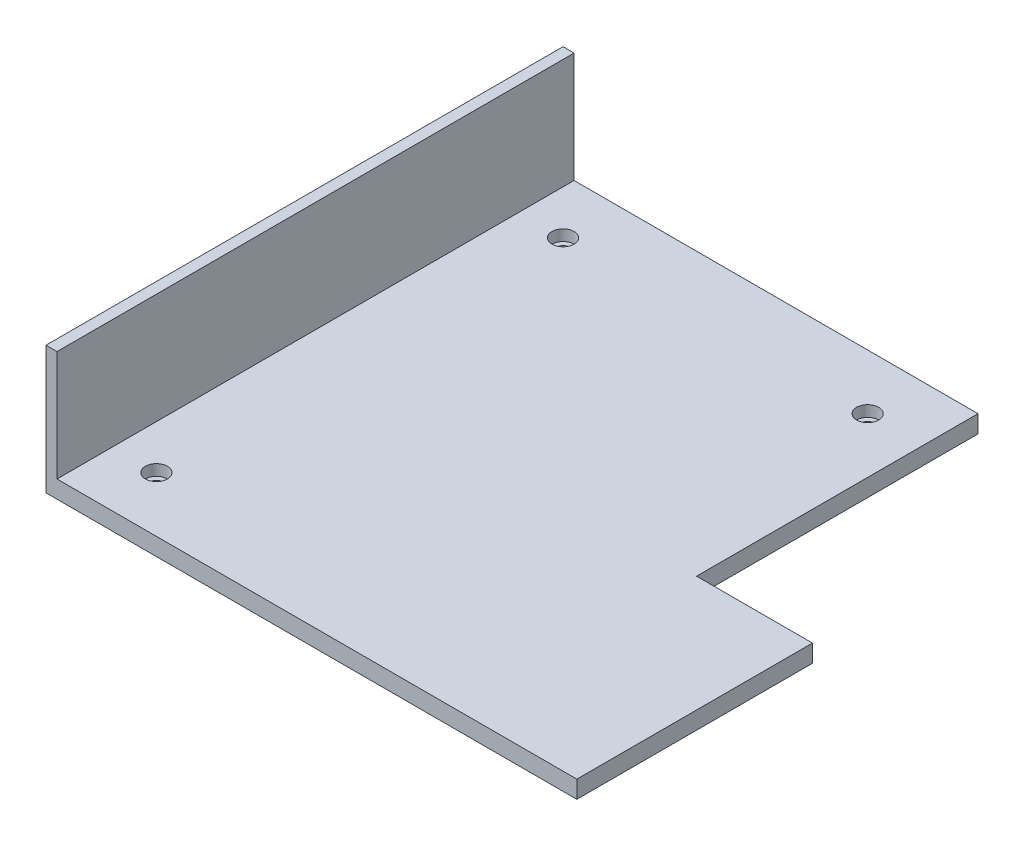
ISO-10303-21;
HEADER;
FILE_DESCRIPTION(('STEP AP214'),'2;1');
FILE_NAME('part.step','',(''),(''),'','','');
FILE_SCHEMA(('AUTOMOTIVE_DESIGN { 1 0 10303 214 1 1 1 1 }'));
ENDSEC;
DATA;
#1=APPLICATION_CONTEXT('core data for automotive mechanical design processes');
#2=APPLICATION_PROTOCOL_DEFINITION('international standard','automotive_design',2000,#1);
#3=PRODUCT_CONTEXT('',#1,'mechanical');
#4=PRODUCT('Part','Part','',(#3));
#5=PRODUCT_RELATED_PRODUCT_CATEGORY('part','',(#4));
#6=PRODUCT_DEFINITION_FORMATION('','',#4);
#7=PRODUCT_DEFINITION_CONTEXT('part definition',#1,'design');
#8=PRODUCT_DEFINITION('design','',#6,#7);
#9=PRODUCT_DEFINITION_SHAPE('','',#8);
#10=(LENGTH_UNIT() NAMED_UNIT(*) SI_UNIT(.MILLI.,.METRE.));
#11=(NAMED_UNIT(*) PLANE_ANGLE_UNIT() SI_UNIT($,.RADIAN.));
#12=(NAMED_UNIT(*) SI_UNIT($,.STERADIAN.) SOLID_ANGLE_UNIT());
#13=UNCERTAINTY_MEASURE_WITH_UNIT(LENGTH_MEASURE(1.E-05),#10,'distance_accuracy_value','');
#14=(GEOMETRIC_REPRESENTATION_CONTEXT(3) GLOBAL_UNCERTAINTY_ASSIGNED_CONTEXT((#13)) GLOBAL_UNIT_ASSIGNED_CONTEXT((#10,
#11,#12)) REPRESENTATION_CONTEXT('',''));
#15=CARTESIAN_POINT('',(0.,0.,0.));
#16=DIRECTION('',(0.,0.,1.));
#17=DIRECTION('',(1.,0.,0.));
#18=AXIS2_PLACEMENT_3D('',#15,#16,#17);
#19=CARTESIAN_POINT('',(96.2,6.35,-93.7));
#20=DIRECTION('',(-1.,0.,0.));
#21=DIRECTION('',(0.,0.,1.));
#22=AXIS2_PLACEMENT_3D('',#19,#20,#21);
#23=PLANE('',#22);
#24=DIRECTION('',(0.,0.,-1.));
#25=VECTOR('',#24,1.);
#26=CARTESIAN_POINT('',(96.2,0.,-93.7));
#27=LINE('',#26,#25);
#28=CARTESIAN_POINT('',(96.2,0.,93.7));
#29=VERTEX_POINT('',#28);
#30=CARTESIAN_POINT('',(96.2,0.,8.3));
#31=VERTEX_POINT('',#30);
#32=EDGE_CURVE('E146',#29,#31,#27,.T.);
#33=ORIENTED_EDGE('',*,*,#32,.T.);
#34=DIRECTION('',(0.,1.,0.));
#35=VECTOR('',#34,1.);
#36=CARTESIAN_POINT('',(96.2,-0.00100000000000013,8.3));
#37=LINE('',#36,#35);
#38=CARTESIAN_POINT('',(96.2,6.35,8.3));
#39=VERTEX_POINT('',#38);
#40=EDGE_CURVE('E180',#31,#39,#37,.T.);
#41=ORIENTED_EDGE('',*,*,#40,.T.);
#42=DIRECTION('',(0.,0.,-1.));
#43=VECTOR('',#42,1.);
#44=CARTESIAN_POINT('',(96.2,6.35,-93.7));
#45=LINE('',#44,#43);
#46=CARTESIAN_POINT('',(96.2,6.35,93.7));
#47=VERTEX_POINT('',#46);
#48=EDGE_CURVE('E136',#47,#39,#45,.T.);
#49=ORIENTED_EDGE('',*,*,#48,.F.);
#50=DIRECTION('',(0.,-1.,0.));
#51=VECTOR('',#50,1.);
#52=CARTESIAN_POINT('',(96.2,6.35,93.7));
#53=LINE('',#52,#51);
#54=EDGE_CURVE('E140',#47,#29,#53,.T.);
#55=ORIENTED_EDGE('',*,*,#54,.T.);
#56=EDGE_LOOP('',(#33,#41,#49,#55));
#57=FACE_BOUND('',#56,.T.);
#58=ADVANCED_FACE('F45',(#57),#23,.F.);
#59=CARTESIAN_POINT('',(-96.2,6.35,-93.7));
#60=DIRECTION('',(0.,0.,1.));
#61=DIRECTION('',(1.,0.,0.));
#62=AXIS2_PLACEMENT_3D('',#59,#60,#61);
#63=PLANE('',#62);
#64=DIRECTION('',(-1.,0.,0.));
#65=VECTOR('',#64,1.);
#66=CARTESIAN_POINT('',(-96.2,6.35,-93.7));
#67=LINE('',#66,#65);
#68=CARTESIAN_POINT('',(54.2,6.35,-93.7));
#69=VERTEX_POINT('',#68);
#70=CARTESIAN_POINT('',(-92.2,6.35,-93.7));
#71=VERTEX_POINT('',#70);
#72=EDGE_CURVE('E125',#69,#71,#67,.T.);
#73=ORIENTED_EDGE('',*,*,#72,.F.);
#74=DIRECTION('',(0.,1.,0.));
#75=VECTOR('',#74,1.);
#76=CARTESIAN_POINT('',(54.2,-0.00100000000000013,-93.7));
#77=LINE('',#76,#75);
#78=CARTESIAN_POINT('',(54.2,0.,-93.7));
#79=VERTEX_POINT('',#78);
#80=EDGE_CURVE('E110',#79,#69,#77,.T.);
#81=ORIENTED_EDGE('',*,*,#80,.F.);
#82=DIRECTION('',(-1.,0.,0.));
#83=VECTOR('',#82,1.);
#84=CARTESIAN_POINT('',(-96.2,0.,-93.7));
#85=LINE('',#84,#83);
#86=CARTESIAN_POINT('',(-96.2,0.,-93.7));
#87=VERTEX_POINT('',#86);
#88=EDGE_CURVE('E150',#79,#87,#85,.T.);
#89=ORIENTED_EDGE('',*,*,#88,.T.);
#90=DIRECTION('',(0.,-1.,0.));
#91=VECTOR('',#90,1.);
#92=CARTESIAN_POINT('',(-96.2,6.35,-93.7));
#93=LINE('',#92,#91);
#94=CARTESIAN_POINT('',(-96.2,46.35,-93.7));
#95=VERTEX_POINT('',#94);
#96=EDGE_CURVE('E11',#95,#87,#93,.T.);
#97=ORIENTED_EDGE('',*,*,#96,.F.);
#98=DIRECTION('',(-1.,0.,0.));
#99=VECTOR('',#98,1.);
#100=CARTESIAN_POINT('',(-92.2,46.35,-93.7));
#101=LINE('',#100,#99);
#102=CARTESIAN_POINT('',(-92.2,46.35,-93.7));
#103=VERTEX_POINT('',#102);
#104=EDGE_CURVE('E192',#103,#95,#101,.T.);
#105=ORIENTED_EDGE('',*,*,#104,.F.);
#106=DIRECTION('',(0.,-1.,0.));
#107=VECTOR('',#106,1.);
#108=CARTESIAN_POINT('',(-92.2,46.35,-93.7));
#109=LINE('',#108,#107);
#110=EDGE_CURVE('E133',#103,#71,#109,.T.);
#111=ORIENTED_EDGE('',*,*,#110,.T.);
#112=EDGE_LOOP('',(#73,#81,#89,#97,#105,#111));
#113=FACE_BOUND('',#112,.T.);
#114=ADVANCED_FACE('F130',(#113),#63,.F.);
#115=CARTESIAN_POINT('',(-96.2,6.35,-93.7));
#116=DIRECTION('',(1.,0.,0.));
#117=DIRECTION('',(0.,0.,-1.));
#118=AXIS2_PLACEMENT_3D('',#115,#116,#117);
#119=PLANE('',#118);
#120=DIRECTION('',(0.,0.,1.));
#121=VECTOR('',#120,1.);
#122=CARTESIAN_POINT('',(-96.2,0.,-93.7));
#123=LINE('',#122,#121);
#124=CARTESIAN_POINT('',(-96.2,0.,93.7));
#125=VERTEX_POINT('',#124);
#126=EDGE_CURVE('E154',#87,#125,#123,.T.);
#127=ORIENTED_EDGE('',*,*,#126,.T.);
#128=DIRECTION('',(0.,-1.,0.));
#129=VECTOR('',#128,1.);
#130=CARTESIAN_POINT('',(-96.2,6.35,93.7));
#131=LINE('',#130,#129);
#132=CARTESIAN_POINT('',(-96.2,46.35,93.7));
#133=VERTEX_POINT('',#132);
#134=EDGE_CURVE('E53',#133,#125,#131,.T.);
#135=ORIENTED_EDGE('',*,*,#134,.F.);
#136=DIRECTION('',(0.,0.,1.));
#137=VECTOR('',#136,1.);
#138=CARTESIAN_POINT('',(-96.2,46.35,-93.7));
#139=LINE('',#138,#137);
#140=EDGE_CURVE('E197',#95,#133,#139,.T.);
#141=ORIENTED_EDGE('',*,*,#140,.F.);
#142=ORIENTED_EDGE('',*,*,#96,.T.);
#143=EDGE_LOOP('',(#127,#135,#141,#142));
#144=FACE_BOUND('',#143,.T.);
#145=ADVANCED_FACE('F293',(#144),#119,.F.);
#146=CARTESIAN_POINT('',(-96.2,6.35,93.7));
#147=DIRECTION('',(0.,0.,-1.));
#148=DIRECTION('',(-1.,0.,0.));
#149=AXIS2_PLACEMENT_3D('',#146,#147,#148);
#150=PLANE('',#149);
#151=DIRECTION('',(1.,0.,0.));
#152=VECTOR('',#151,1.);
#153=CARTESIAN_POINT('',(-96.2,0.,93.7));
#154=LINE('',#153,#152);
#155=EDGE_CURVE('E142',#125,#29,#154,.T.);
#156=ORIENTED_EDGE('',*,*,#155,.T.);
#157=ORIENTED_EDGE('',*,*,#54,.F.);
#158=DIRECTION('',(1.,0.,0.));
#159=VECTOR('',#158,1.);
#160=CARTESIAN_POINT('',(-96.2,6.35,93.7));
#161=LINE('',#160,#159);
#162=CARTESIAN_POINT('',(-92.2,6.35,93.7));
#163=VERTEX_POINT('',#162);
#164=EDGE_CURVE('E135',#163,#47,#161,.T.);
#165=ORIENTED_EDGE('',*,*,#164,.F.);
#166=DIRECTION('',(0.,-1.,0.));
#167=VECTOR('',#166,1.);
#168=CARTESIAN_POINT('',(-92.2,46.35,93.7));
#169=LINE('',#168,#167);
#170=CARTESIAN_POINT('',(-92.2,46.35,93.7));
#171=VERTEX_POINT('',#170);
#172=EDGE_CURVE('E151',#171,#163,#169,.T.);
#173=ORIENTED_EDGE('',*,*,#172,.F.);
#174=DIRECTION('',(1.,0.,0.));
#175=VECTOR('',#174,1.);
#176=CARTESIAN_POINT('',(-92.2,46.35,93.7));
#177=LINE('',#176,#175);
#178=EDGE_CURVE('E169',#133,#171,#177,.T.);
#179=ORIENTED_EDGE('',*,*,#178,.F.);
#180=ORIENTED_EDGE('',*,*,#134,.T.);
#181=EDGE_LOOP('',(#156,#157,#165,#173,#179,#180));
#182=FACE_BOUND('',#181,.T.);
#183=ADVANCED_FACE('F166',(#182),#150,.F.);
#184=CARTESIAN_POINT('',(0.,6.35,0.));
#185=DIRECTION('',(0.,1.,0.));
#186=DIRECTION('',(0.,0.,1.));
#187=AXIS2_PLACEMENT_3D('',#184,#185,#186);
#188=PLANE('',#187);
#189=CARTESIAN_POINT('',(-76.2,6.35,-73.7));
#190=DIRECTION('',(0.,1.,0.));
#191=DIRECTION('',(0.,0.,1.));
#192=AXIS2_PLACEMENT_3D('',#189,#190,#191);
#193=CIRCLE('',#192,3.99999999999999);
#194=CARTESIAN_POINT('',(-76.2,6.35,-69.7));
#195=VERTEX_POINT('',#194);
#196=EDGE_CURVE('E257',#195,#195,#193,.T.);
#197=ORIENTED_EDGE('',*,*,#196,.F.);
#198=EDGE_LOOP('',(#197));
#199=FACE_BOUND('',#198,.T.);
#200=CARTESIAN_POINT('',(-76.2,6.35,73.7));
#201=DIRECTION('',(0.,1.,0.));
#202=DIRECTION('',(0.,0.,1.));
#203=AXIS2_PLACEMENT_3D('',#200,#201,#202);
#204=CIRCLE('',#203,3.99999999999999);
#205=CARTESIAN_POINT('',(-76.2,6.35,77.7));
#206=VERTEX_POINT('',#205);
#207=EDGE_CURVE('E241',#206,#206,#204,.T.);
#208=ORIENTED_EDGE('',*,*,#207,.F.);
#209=EDGE_LOOP('',(#208));
#210=FACE_BOUND('',#209,.T.);
#211=CARTESIAN_POINT('',(34.2,6.35,-73.7));
#212=DIRECTION('',(0.,1.,0.));
#213=DIRECTION('',(0.,0.,1.));
#214=AXIS2_PLACEMENT_3D('',#211,#212,#213);
#215=CIRCLE('',#214,3.99999999999999);
#216=CARTESIAN_POINT('',(34.2,6.35,-69.7));
#217=VERTEX_POINT('',#216);
#218=EDGE_CURVE('E225',#217,#217,#215,.T.);
#219=ORIENTED_EDGE('',*,*,#218,.F.);
#220=EDGE_LOOP('',(#219));
#221=FACE_BOUND('',#220,.T.);
#222=DIRECTION('',(1.,0.,0.));
#223=VECTOR('',#222,1.);
#224=CARTESIAN_POINT('',(96.2,6.35,8.3));
#225=LINE('',#224,#223);
#226=CARTESIAN_POINT('',(54.2,6.35,8.30000000000001));
#227=VERTEX_POINT('',#226);
#228=EDGE_CURVE('E122',#227,#39,#225,.T.);
#229=ORIENTED_EDGE('',*,*,#228,.F.);
#230=DIRECTION('',(0.,0.,1.));
#231=VECTOR('',#230,1.);
#232=CARTESIAN_POINT('',(54.2,6.35,-93.7));
#233=LINE('',#232,#231);
#234=EDGE_CURVE('E113',#69,#227,#233,.T.);
#235=ORIENTED_EDGE('',*,*,#234,.F.);
#236=ORIENTED_EDGE('',*,*,#72,.T.);
#237=DIRECTION('',(0.,0.,-1.));
#238=VECTOR('',#237,1.);
#239=CARTESIAN_POINT('',(-92.2,6.35,-89.7));
#240=LINE('',#239,#238);
#241=EDGE_CURVE('E68',#163,#71,#240,.T.);
#242=ORIENTED_EDGE('',*,*,#241,.F.);
#243=ORIENTED_EDGE('',*,*,#164,.T.);
#244=ORIENTED_EDGE('',*,*,#48,.T.);
#245=EDGE_LOOP('',(#229,#235,#236,#242,#243,#244));
#246=FACE_BOUND('',#245,.T.);
#247=ADVANCED_FACE('F124',(#199,#210,#221,#246),#188,.T.);
#248=CARTESIAN_POINT('',(0.,0.,0.));
#249=DIRECTION('',(0.,1.,0.));
#250=DIRECTION('',(0.,0.,1.));
#251=AXIS2_PLACEMENT_3D('',#248,#249,#250);
#252=PLANE('',#251);
#253=CARTESIAN_POINT('',(-76.2,0.,-73.7));
#254=DIRECTION('',(0.,1.,0.));
#255=DIRECTION('',(0.,0.,1.));
#256=AXIS2_PLACEMENT_3D('',#253,#254,#255);
#257=CIRCLE('',#256,2.25000000000001);
#258=CARTESIAN_POINT('',(-76.2,0.,-71.45));
#259=VERTEX_POINT('',#258);
#260=EDGE_CURVE('E245',#259,#259,#257,.T.);
#261=ORIENTED_EDGE('',*,*,#260,.T.);
#262=EDGE_LOOP('',(#261));
#263=FACE_BOUND('',#262,.T.);
#264=CARTESIAN_POINT('',(-76.2,0.,73.7));
#265=DIRECTION('',(0.,1.,0.));
#266=DIRECTION('',(0.,0.,1.));
#267=AXIS2_PLACEMENT_3D('',#264,#265,#266);
#268=CIRCLE('',#267,2.25000000000001);
#269=CARTESIAN_POINT('',(-76.2,0.,75.95));
#270=VERTEX_POINT('',#269);
#271=EDGE_CURVE('E229',#270,#270,#268,.T.);
#272=ORIENTED_EDGE('',*,*,#271,.T.);
#273=EDGE_LOOP('',(#272));
#274=FACE_BOUND('',#273,.T.);
#275=CARTESIAN_POINT('',(34.2,0.,-73.7));
#276=DIRECTION('',(0.,1.,0.));
#277=DIRECTION('',(0.,0.,1.));
#278=AXIS2_PLACEMENT_3D('',#275,#276,#277);
#279=CIRCLE('',#278,2.25000000000001);
#280=CARTESIAN_POINT('',(34.2,0.,-71.45));
#281=VERTEX_POINT('',#280);
#282=EDGE_CURVE('E213',#281,#281,#279,.T.);
#283=ORIENTED_EDGE('',*,*,#282,.T.);
#284=EDGE_LOOP('',(#283));
#285=FACE_BOUND('',#284,.T.);
#286=DIRECTION('',(0.,0.,-1.));
#287=VECTOR('',#286,1.);
#288=CARTESIAN_POINT('',(54.2,0.,-93.7));
#289=LINE('',#288,#287);
#290=CARTESIAN_POINT('',(54.2,0.,8.30000000000001));
#291=VERTEX_POINT('',#290);
#292=EDGE_CURVE('E116',#291,#79,#289,.T.);
#293=ORIENTED_EDGE('',*,*,#292,.F.);
#294=DIRECTION('',(-1.,0.,0.));
#295=VECTOR('',#294,1.);
#296=CARTESIAN_POINT('',(96.2,0.,8.3));
#297=LINE('',#296,#295);
#298=EDGE_CURVE('E60',#31,#291,#297,.T.);
#299=ORIENTED_EDGE('',*,*,#298,.F.);
#300=ORIENTED_EDGE('',*,*,#32,.F.);
#301=ORIENTED_EDGE('',*,*,#155,.F.);
#302=ORIENTED_EDGE('',*,*,#126,.F.);
#303=ORIENTED_EDGE('',*,*,#88,.F.);
#304=EDGE_LOOP('',(#293,#299,#300,#301,#302,#303));
#305=FACE_BOUND('',#304,.T.);
#306=ADVANCED_FACE('F176',(#263,#274,#285,#305),#252,.F.);
#307=CARTESIAN_POINT('',(-92.2,46.35,-89.7));
#308=DIRECTION('',(-1.,0.,0.));
#309=DIRECTION('',(0.,0.,1.));
#310=AXIS2_PLACEMENT_3D('',#307,#308,#309);
#311=PLANE('',#310);
#312=ORIENTED_EDGE('',*,*,#241,.T.);
#313=ORIENTED_EDGE('',*,*,#110,.F.);
#314=DIRECTION('',(0.,0.,-1.));
#315=VECTOR('',#314,1.);
#316=CARTESIAN_POINT('',(-92.2,46.35,89.7));
#317=LINE('',#316,#315);
#318=EDGE_CURVE('E185',#171,#103,#317,.T.);
#319=ORIENTED_EDGE('',*,*,#318,.F.);
#320=ORIENTED_EDGE('',*,*,#172,.T.);
#321=EDGE_LOOP('',(#312,#313,#319,#320));
#322=FACE_BOUND('',#321,.T.);
#323=ADVANCED_FACE('F184',(#322),#311,.F.);
#324=CARTESIAN_POINT('',(0.,46.35,0.));
#325=DIRECTION('',(0.,1.,0.));
#326=DIRECTION('',(0.,0.,1.));
#327=AXIS2_PLACEMENT_3D('',#324,#325,#326);
#328=PLANE('',#327);
#329=ORIENTED_EDGE('',*,*,#104,.T.);
#330=ORIENTED_EDGE('',*,*,#140,.T.);
#331=ORIENTED_EDGE('',*,*,#178,.T.);
#332=ORIENTED_EDGE('',*,*,#318,.T.);
#333=EDGE_LOOP('',(#329,#330,#331,#332));
#334=FACE_BOUND('',#333,.T.);
#335=ADVANCED_FACE('F307',(#334),#328,.T.);
#336=CARTESIAN_POINT('',(96.2,-0.00100000000000013,8.3));
#337=DIRECTION('',(0.,0.,1.));
#338=DIRECTION('',(1.,0.,0.));
#339=AXIS2_PLACEMENT_3D('',#336,#337,#338);
#340=PLANE('',#339);
#341=ORIENTED_EDGE('',*,*,#298,.T.);
#342=DIRECTION('',(0.,1.,0.));
#343=VECTOR('',#342,1.);
#344=CARTESIAN_POINT('',(54.2,-0.00100000000000013,8.30000000000001));
#345=LINE('',#344,#343);
#346=EDGE_CURVE('E121',#291,#227,#345,.T.);
#347=ORIENTED_EDGE('',*,*,#346,.T.);
#348=ORIENTED_EDGE('',*,*,#228,.T.);
#349=ORIENTED_EDGE('',*,*,#40,.F.);
#350=EDGE_LOOP('',(#341,#347,#348,#349));
#351=FACE_BOUND('',#350,.T.);
#352=ADVANCED_FACE('F309',(#351),#340,.F.);
#353=CARTESIAN_POINT('',(54.2,-0.00100000000000013,-93.7));
#354=DIRECTION('',(-1.,0.,0.));
#355=DIRECTION('',(0.,0.,1.));
#356=AXIS2_PLACEMENT_3D('',#353,#354,#355);
#357=PLANE('',#356);
#358=ORIENTED_EDGE('',*,*,#292,.T.);
#359=ORIENTED_EDGE('',*,*,#80,.T.);
#360=ORIENTED_EDGE('',*,*,#234,.T.);
#361=ORIENTED_EDGE('',*,*,#346,.F.);
#362=EDGE_LOOP('',(#358,#359,#360,#361));
#363=FACE_BOUND('',#362,.T.);
#364=ADVANCED_FACE('F112',(#363),#357,.F.);
#365=CARTESIAN_POINT('',(34.2,6.35,-73.7));
#366=DIRECTION('',(0.,1.,0.));
#367=DIRECTION('',(0.,0.,1.));
#368=AXIS2_PLACEMENT_3D('',#365,#366,#367);
#369=CYLINDRICAL_SURFACE('',#368,2.25000000000001);
#370=ORIENTED_EDGE('',*,*,#282,.F.);
#371=EDGE_LOOP('',(#370));
#372=FACE_BOUND('',#371,.T.);
#373=CARTESIAN_POINT('',(34.2,2.35,-73.7));
#374=DIRECTION('',(0.,1.,0.));
#375=DIRECTION('',(0.,0.,1.));
#376=AXIS2_PLACEMENT_3D('',#373,#374,#375);
#377=CIRCLE('',#376,2.25000000000002);
#378=CARTESIAN_POINT('',(34.2,2.35,-71.45));
#379=VERTEX_POINT('',#378);
#380=EDGE_CURVE('E217',#379,#379,#377,.T.);
#381=ORIENTED_EDGE('',*,*,#380,.T.);
#382=EDGE_LOOP('',(#381));
#383=FACE_BOUND('',#382,.T.);
#384=ADVANCED_FACE('F284',(#372,#383),#369,.F.);
#385=CARTESIAN_POINT('',(36.45,2.35,-73.7));
#386=DIRECTION('',(0.,-1.,0.));
#387=DIRECTION('',(0.,0.,-1.));
#388=AXIS2_PLACEMENT_3D('',#385,#386,#387);
#389=PLANE('',#388);
#390=ORIENTED_EDGE('',*,*,#380,.F.);
#391=EDGE_LOOP('',(#390));
#392=FACE_BOUND('',#391,.T.);
#393=CARTESIAN_POINT('',(34.2,2.35,-73.7));
#394=DIRECTION('',(0.,1.,0.));
#395=DIRECTION('',(0.,0.,1.));
#396=AXIS2_PLACEMENT_3D('',#393,#394,#395);
#397=CIRCLE('',#396,3.99999999999999);
#398=CARTESIAN_POINT('',(34.2,2.35,-69.7));
#399=VERTEX_POINT('',#398);
#400=EDGE_CURVE('E221',#399,#399,#397,.T.);
#401=ORIENTED_EDGE('',*,*,#400,.T.);
#402=EDGE_LOOP('',(#401));
#403=FACE_BOUND('',#402,.T.);
#404=ADVANCED_FACE('F274',(#392,#403),#389,.F.);
#405=CARTESIAN_POINT('',(34.2,6.35,-73.7));
#406=DIRECTION('',(0.,1.,0.));
#407=DIRECTION('',(0.,0.,1.));
#408=AXIS2_PLACEMENT_3D('',#405,#406,#407);
#409=CYLINDRICAL_SURFACE('',#408,3.99999999999999);
#410=ORIENTED_EDGE('',*,*,#400,.F.);
#411=EDGE_LOOP('',(#410));
#412=FACE_BOUND('',#411,.T.);
#413=ORIENTED_EDGE('',*,*,#218,.T.);
#414=EDGE_LOOP('',(#413));
#415=FACE_BOUND('',#414,.T.);
#416=ADVANCED_FACE('F271',(#412,#415),#409,.F.);
#417=CARTESIAN_POINT('',(-76.2,6.35,73.7));
#418=DIRECTION('',(0.,1.,0.));
#419=DIRECTION('',(0.,0.,1.));
#420=AXIS2_PLACEMENT_3D('',#417,#418,#419);
#421=CYLINDRICAL_SURFACE('',#420,2.25000000000001);
#422=ORIENTED_EDGE('',*,*,#271,.F.);
#423=EDGE_LOOP('',(#422));
#424=FACE_BOUND('',#423,.T.);
#425=CARTESIAN_POINT('',(-76.2,2.35,73.7));
#426=DIRECTION('',(0.,1.,0.));
#427=DIRECTION('',(0.,0.,1.));
#428=AXIS2_PLACEMENT_3D('',#425,#426,#427);
#429=CIRCLE('',#428,2.25000000000002);
#430=CARTESIAN_POINT('',(-76.2,2.35,75.95));
#431=VERTEX_POINT('',#430);
#432=EDGE_CURVE('E233',#431,#431,#429,.T.);
#433=ORIENTED_EDGE('',*,*,#432,.T.);
#434=EDGE_LOOP('',(#433));
#435=FACE_BOUND('',#434,.T.);
#436=ADVANCED_FACE('F273',(#424,#435),#421,.F.);
#437=CARTESIAN_POINT('',(-73.95,2.35,73.7));
#438=DIRECTION('',(0.,-1.,0.));
#439=DIRECTION('',(0.,0.,-1.));
#440=AXIS2_PLACEMENT_3D('',#437,#438,#439);
#441=PLANE('',#440);
#442=ORIENTED_EDGE('',*,*,#432,.F.);
#443=EDGE_LOOP('',(#442));
#444=FACE_BOUND('',#443,.T.);
#445=CARTESIAN_POINT('',(-76.2,2.35,73.7));
#446=DIRECTION('',(0.,1.,0.));
#447=DIRECTION('',(0.,0.,1.));
#448=AXIS2_PLACEMENT_3D('',#445,#446,#447);
#449=CIRCLE('',#448,3.99999999999999);
#450=CARTESIAN_POINT('',(-76.2,2.35,77.7));
#451=VERTEX_POINT('',#450);
#452=EDGE_CURVE('E237',#451,#451,#449,.T.);
#453=ORIENTED_EDGE('',*,*,#452,.T.);
#454=EDGE_LOOP('',(#453));
#455=FACE_BOUND('',#454,.T.);
#456=ADVANCED_FACE('F281',(#444,#455),#441,.F.);
#457=CARTESIAN_POINT('',(-76.2,6.35,73.7));
#458=DIRECTION('',(0.,1.,0.));
#459=DIRECTION('',(0.,0.,1.));
#460=AXIS2_PLACEMENT_3D('',#457,#458,#459);
#461=CYLINDRICAL_SURFACE('',#460,3.99999999999999);
#462=ORIENTED_EDGE('',*,*,#452,.F.);
#463=EDGE_LOOP('',(#462));
#464=FACE_BOUND('',#463,.T.);
#465=ORIENTED_EDGE('',*,*,#207,.T.);
#466=EDGE_LOOP('',(#465));
#467=FACE_BOUND('',#466,.T.);
#468=ADVANCED_FACE('F351',(#464,#467),#461,.F.);
#469=CARTESIAN_POINT('',(-76.2,6.35,-73.7));
#470=DIRECTION('',(0.,1.,0.));
#471=DIRECTION('',(0.,0.,1.));
#472=AXIS2_PLACEMENT_3D('',#469,#470,#471);
#473=CYLINDRICAL_SURFACE('',#472,2.25000000000001);
#474=ORIENTED_EDGE('',*,*,#260,.F.);
#475=EDGE_LOOP('',(#474));
#476=FACE_BOUND('',#475,.T.);
#477=CARTESIAN_POINT('',(-76.2,2.35,-73.7));
#478=DIRECTION('',(0.,1.,0.));
#479=DIRECTION('',(0.,0.,1.));
#480=AXIS2_PLACEMENT_3D('',#477,#478,#479);
#481=CIRCLE('',#480,2.25000000000002);
#482=CARTESIAN_POINT('',(-76.2,2.35,-71.45));
#483=VERTEX_POINT('',#482);
#484=EDGE_CURVE('E249',#483,#483,#481,.T.);
#485=ORIENTED_EDGE('',*,*,#484,.T.);
#486=EDGE_LOOP('',(#485));
#487=FACE_BOUND('',#486,.T.);
#488=ADVANCED_FACE('F361',(#476,#487),#473,.F.);
#489=CARTESIAN_POINT('',(-73.95,2.35,-73.7));
#490=DIRECTION('',(0.,-1.,0.));
#491=DIRECTION('',(0.,0.,-1.));
#492=AXIS2_PLACEMENT_3D('',#489,#490,#491);
#493=PLANE('',#492);
#494=ORIENTED_EDGE('',*,*,#484,.F.);
#495=EDGE_LOOP('',(#494));
#496=FACE_BOUND('',#495,.T.);
#497=CARTESIAN_POINT('',(-76.2,2.35,-73.7));
#498=DIRECTION('',(0.,1.,0.));
#499=DIRECTION('',(0.,0.,1.));
#500=AXIS2_PLACEMENT_3D('',#497,#498,#499);
#501=CIRCLE('',#500,3.99999999999999);
#502=CARTESIAN_POINT('',(-76.2,2.35,-69.7));
#503=VERTEX_POINT('',#502);
#504=EDGE_CURVE('E253',#503,#503,#501,.T.);
#505=ORIENTED_EDGE('',*,*,#504,.T.);
#506=EDGE_LOOP('',(#505));
#507=FACE_BOUND('',#506,.T.);
#508=ADVANCED_FACE('F371',(#496,#507),#493,.F.);
#509=CARTESIAN_POINT('',(-76.2,6.35,-73.7));
#510=DIRECTION('',(0.,1.,0.));
#511=DIRECTION('',(0.,0.,1.));
#512=AXIS2_PLACEMENT_3D('',#509,#510,#511);
#513=CYLINDRICAL_SURFACE('',#512,3.99999999999999);
#514=ORIENTED_EDGE('',*,*,#504,.F.);
#515=EDGE_LOOP('',(#514));
#516=FACE_BOUND('',#515,.T.);
#517=ORIENTED_EDGE('',*,*,#196,.T.);
#518=EDGE_LOOP('',(#517));
#519=FACE_BOUND('',#518,.T.);
#520=ADVANCED_FACE('F262',(#516,#519),#513,.F.);
#521=CLOSED_SHELL('',(#58,#114,#145,#183,#247,#306,#323,#335,#352,#364,#384,#404,#416,#436,#456,
#468,#488,#508,#520));
#522=MANIFOLD_SOLID_BREP('B2',#521);
#523=ADVANCED_BREP_SHAPE_REPRESENTATION('',(#18,#522),#14);
#524=SHAPE_DEFINITION_REPRESENTATION(#9,#523);
ENDSEC;
END-ISO-10303-21;
